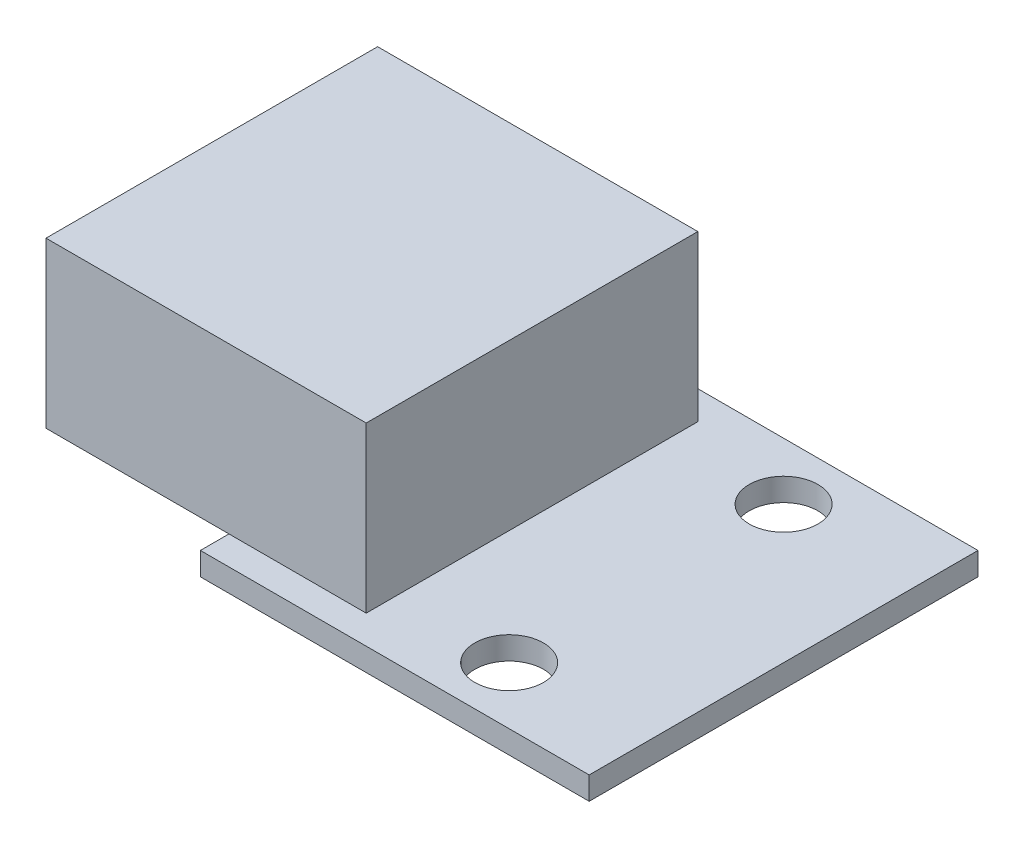
ISO-10303-21;
HEADER;
FILE_DESCRIPTION(('STEP AP214'),'2;1');
FILE_NAME('part.step','',(''),(''),'','','');
FILE_SCHEMA(('AUTOMOTIVE_DESIGN { 1 0 10303 214 1 1 1 1 }'));
ENDSEC;
DATA;
#1=APPLICATION_CONTEXT('core data for automotive mechanical design processes');
#2=APPLICATION_PROTOCOL_DEFINITION('international standard','automotive_design',2000,#1);
#3=PRODUCT_CONTEXT('',#1,'mechanical');
#4=PRODUCT('Part','Part','',(#3));
#5=PRODUCT_RELATED_PRODUCT_CATEGORY('part','',(#4));
#6=PRODUCT_DEFINITION_FORMATION('','',#4);
#7=PRODUCT_DEFINITION_CONTEXT('part definition',#1,'design');
#8=PRODUCT_DEFINITION('design','',#6,#7);
#9=PRODUCT_DEFINITION_SHAPE('','',#8);
#10=(LENGTH_UNIT() NAMED_UNIT(*) SI_UNIT(.MILLI.,.METRE.));
#11=(NAMED_UNIT(*) PLANE_ANGLE_UNIT() SI_UNIT($,.RADIAN.));
#12=(NAMED_UNIT(*) SI_UNIT($,.STERADIAN.) SOLID_ANGLE_UNIT());
#13=UNCERTAINTY_MEASURE_WITH_UNIT(LENGTH_MEASURE(1.E-05),#10,'distance_accuracy_value','');
#14=(GEOMETRIC_REPRESENTATION_CONTEXT(3) GLOBAL_UNCERTAINTY_ASSIGNED_CONTEXT((#13)) GLOBAL_UNIT_ASSIGNED_CONTEXT((#10,
#11,#12)) REPRESENTATION_CONTEXT('',''));
#15=CARTESIAN_POINT('',(0.,0.,0.));
#16=DIRECTION('',(0.,0.,1.));
#17=DIRECTION('',(1.,0.,0.));
#18=AXIS2_PLACEMENT_3D('',#15,#16,#17);
#19=CARTESIAN_POINT('',(0.,1.,0.));
#20=DIRECTION('',(0.,1.,0.));
#21=DIRECTION('',(0.,0.,1.));
#22=AXIS2_PLACEMENT_3D('',#19,#20,#21);
#23=PLANE('',#22);
#24=DIRECTION('',(-1.,0.,0.));
#25=VECTOR('',#24,1.);
#26=CARTESIAN_POINT('',(-11.,1.,-15.75));
#27=LINE('',#26,#25);
#28=CARTESIAN_POINT('',(-11.,1.,-15.75));
#29=VERTEX_POINT('',#28);
#30=CARTESIAN_POINT('',(-17.,1.,-15.75));
#31=VERTEX_POINT('',#30);
#32=EDGE_CURVE('E200',#29,#31,#27,.T.);
#33=ORIENTED_EDGE('',*,*,#32,.F.);
#34=DIRECTION('',(0.,0.,1.));
#35=VECTOR('',#34,1.);
#36=CARTESIAN_POINT('',(-11.,1.,-15.75));
#37=LINE('',#36,#35);
#38=CARTESIAN_POINT('',(-11.,1.,-1.25));
#39=VERTEX_POINT('',#38);
#40=EDGE_CURVE('E171',#29,#39,#37,.T.);
#41=ORIENTED_EDGE('',*,*,#40,.T.);
#42=DIRECTION('',(-1.,0.,0.));
#43=VECTOR('',#42,1.);
#44=CARTESIAN_POINT('',(-11.,1.,-1.25));
#45=LINE('',#44,#43);
#46=CARTESIAN_POINT('',(-17.,1.,-1.25));
#47=VERTEX_POINT('',#46);
#48=EDGE_CURVE('E197',#39,#47,#45,.T.);
#49=ORIENTED_EDGE('',*,*,#48,.T.);
#50=DIRECTION('',(0.,0.,1.));
#51=VECTOR('',#50,1.);
#52=CARTESIAN_POINT('',(-17.,1.,0.));
#53=LINE('',#52,#51);
#54=CARTESIAN_POINT('',(-17.,1.,0.));
#55=VERTEX_POINT('',#54);
#56=EDGE_CURVE('E221',#47,#55,#53,.T.);
#57=ORIENTED_EDGE('',*,*,#56,.T.);
#58=DIRECTION('',(1.,0.,0.));
#59=VECTOR('',#58,1.);
#60=CARTESIAN_POINT('',(0.,1.,0.));
#61=LINE('',#60,#59);
#62=CARTESIAN_POINT('',(0.,1.,0.));
#63=VERTEX_POINT('',#62);
#64=EDGE_CURVE('E225',#55,#63,#61,.T.);
#65=ORIENTED_EDGE('',*,*,#64,.T.);
#66=DIRECTION('',(0.,0.,-1.));
#67=VECTOR('',#66,1.);
#68=CARTESIAN_POINT('',(0.,1.,0.));
#69=LINE('',#68,#67);
#70=CARTESIAN_POINT('',(0.,1.,-17.));
#71=VERTEX_POINT('',#70);
#72=EDGE_CURVE('E215',#63,#71,#69,.T.);
#73=ORIENTED_EDGE('',*,*,#72,.T.);
#74=DIRECTION('',(-1.,0.,0.));
#75=VECTOR('',#74,1.);
#76=CARTESIAN_POINT('',(0.,1.,-17.));
#77=LINE('',#76,#75);
#78=CARTESIAN_POINT('',(-17.,1.,-17.));
#79=VERTEX_POINT('',#78);
#80=EDGE_CURVE('E218',#71,#79,#77,.T.);
#81=ORIENTED_EDGE('',*,*,#80,.T.);
#82=EDGE_CURVE('E222',#79,#31,#53,.T.);
#83=ORIENTED_EDGE('',*,*,#82,.T.);
#84=EDGE_LOOP('',(#33,#41,#49,#57,#65,#73,#81,#83));
#85=FACE_BOUND('',#84,.T.);
#86=CARTESIAN_POINT('',(-6.,1.,-14.5));
#87=DIRECTION('',(0.,1.,0.));
#88=DIRECTION('',(0.,0.,1.));
#89=AXIS2_PLACEMENT_3D('',#86,#87,#88);
#90=CIRCLE('',#89,1.5);
#91=CARTESIAN_POINT('',(-6.,1.,-13.));
#92=VERTEX_POINT('',#91);
#93=EDGE_CURVE('E209',#92,#92,#90,.T.);
#94=ORIENTED_EDGE('',*,*,#93,.F.);
#95=EDGE_LOOP('',(#94));
#96=FACE_BOUND('',#95,.T.);
#97=CARTESIAN_POINT('',(-6.,1.,-2.5));
#98=DIRECTION('',(0.,1.,0.));
#99=DIRECTION('',(0.,0.,1.));
#100=AXIS2_PLACEMENT_3D('',#97,#98,#99);
#101=CIRCLE('',#100,1.5);
#102=CARTESIAN_POINT('',(-6.,1.,-1.));
#103=VERTEX_POINT('',#102);
#104=EDGE_CURVE('E203',#103,#103,#101,.T.);
#105=ORIENTED_EDGE('',*,*,#104,.F.);
#106=EDGE_LOOP('',(#105));
#107=FACE_BOUND('',#106,.T.);
#108=ADVANCED_FACE('F34',(#85,#96,#107),#23,.T.);
#109=CARTESIAN_POINT('',(0.,0.,0.));
#110=DIRECTION('',(0.,1.,0.));
#111=DIRECTION('',(0.,0.,1.));
#112=AXIS2_PLACEMENT_3D('',#109,#110,#111);
#113=PLANE('',#112);
#114=DIRECTION('',(0.,0.,-1.));
#115=VECTOR('',#114,1.);
#116=CARTESIAN_POINT('',(0.,0.,0.));
#117=LINE('',#116,#115);
#118=CARTESIAN_POINT('',(0.,0.,0.));
#119=VERTEX_POINT('',#118);
#120=CARTESIAN_POINT('',(0.,0.,-17.));
#121=VERTEX_POINT('',#120);
#122=EDGE_CURVE('E212',#119,#121,#117,.T.);
#123=ORIENTED_EDGE('',*,*,#122,.F.);
#124=DIRECTION('',(1.,0.,0.));
#125=VECTOR('',#124,1.);
#126=CARTESIAN_POINT('',(0.,0.,0.));
#127=LINE('',#126,#125);
#128=CARTESIAN_POINT('',(-17.,0.,0.));
#129=VERTEX_POINT('',#128);
#130=EDGE_CURVE('E219',#129,#119,#127,.T.);
#131=ORIENTED_EDGE('',*,*,#130,.F.);
#132=DIRECTION('',(0.,0.,1.));
#133=VECTOR('',#132,1.);
#134=CARTESIAN_POINT('',(-17.,0.,0.));
#135=LINE('',#134,#133);
#136=CARTESIAN_POINT('',(-17.,0.,-17.));
#137=VERTEX_POINT('',#136);
#138=EDGE_CURVE('E233',#137,#129,#135,.T.);
#139=ORIENTED_EDGE('',*,*,#138,.F.);
#140=DIRECTION('',(-1.,0.,0.));
#141=VECTOR('',#140,1.);
#142=CARTESIAN_POINT('',(0.,0.,-17.));
#143=LINE('',#142,#141);
#144=EDGE_CURVE('E231',#121,#137,#143,.T.);
#145=ORIENTED_EDGE('',*,*,#144,.F.);
#146=EDGE_LOOP('',(#123,#131,#139,#145));
#147=FACE_BOUND('',#146,.T.);
#148=CARTESIAN_POINT('',(-6.,0.,-14.5));
#149=DIRECTION('',(0.,1.,0.));
#150=DIRECTION('',(0.,0.,1.));
#151=AXIS2_PLACEMENT_3D('',#148,#149,#150);
#152=CIRCLE('',#151,1.5);
#153=CARTESIAN_POINT('',(-6.,0.,-13.));
#154=VERTEX_POINT('',#153);
#155=EDGE_CURVE('E206',#154,#154,#152,.T.);
#156=ORIENTED_EDGE('',*,*,#155,.T.);
#157=EDGE_LOOP('',(#156));
#158=FACE_BOUND('',#157,.T.);
#159=CARTESIAN_POINT('',(-6.,0.,-2.5));
#160=DIRECTION('',(0.,1.,0.));
#161=DIRECTION('',(0.,0.,1.));
#162=AXIS2_PLACEMENT_3D('',#159,#160,#161);
#163=CIRCLE('',#162,1.5);
#164=CARTESIAN_POINT('',(-6.,0.,-1.));
#165=VERTEX_POINT('',#164);
#166=EDGE_CURVE('E194',#165,#165,#163,.T.);
#167=ORIENTED_EDGE('',*,*,#166,.T.);
#168=EDGE_LOOP('',(#167));
#169=FACE_BOUND('',#168,.T.);
#170=ADVANCED_FACE('F252',(#147,#158,#169),#113,.F.);
#171=CARTESIAN_POINT('',(0.,1.,0.));
#172=DIRECTION('',(-1.,0.,0.));
#173=DIRECTION('',(0.,0.,1.));
#174=AXIS2_PLACEMENT_3D('',#171,#172,#173);
#175=PLANE('',#174);
#176=ORIENTED_EDGE('',*,*,#122,.T.);
#177=DIRECTION('',(0.,-1.,0.));
#178=VECTOR('',#177,1.);
#179=CARTESIAN_POINT('',(0.,1.,-17.));
#180=LINE('',#179,#178);
#181=EDGE_CURVE('E11',#71,#121,#180,.T.);
#182=ORIENTED_EDGE('',*,*,#181,.F.);
#183=ORIENTED_EDGE('',*,*,#72,.F.);
#184=DIRECTION('',(0.,-1.,0.));
#185=VECTOR('',#184,1.);
#186=CARTESIAN_POINT('',(0.,1.,0.));
#187=LINE('',#186,#185);
#188=EDGE_CURVE('E228',#63,#119,#187,.T.);
#189=ORIENTED_EDGE('',*,*,#188,.T.);
#190=EDGE_LOOP('',(#176,#182,#183,#189));
#191=FACE_BOUND('',#190,.T.);
#192=ADVANCED_FACE('F36',(#191),#175,.F.);
#193=CARTESIAN_POINT('',(0.,1.,-17.));
#194=DIRECTION('',(0.,0.,1.));
#195=DIRECTION('',(1.,0.,0.));
#196=AXIS2_PLACEMENT_3D('',#193,#194,#195);
#197=PLANE('',#196);
#198=ORIENTED_EDGE('',*,*,#144,.T.);
#199=DIRECTION('',(0.,-1.,0.));
#200=VECTOR('',#199,1.);
#201=CARTESIAN_POINT('',(-17.,1.,-17.));
#202=LINE('',#201,#200);
#203=EDGE_CURVE('E42',#79,#137,#202,.T.);
#204=ORIENTED_EDGE('',*,*,#203,.F.);
#205=ORIENTED_EDGE('',*,*,#80,.F.);
#206=ORIENTED_EDGE('',*,*,#181,.T.);
#207=EDGE_LOOP('',(#198,#204,#205,#206));
#208=FACE_BOUND('',#207,.T.);
#209=ADVANCED_FACE('F301',(#208),#197,.F.);
#210=CARTESIAN_POINT('',(-17.,1.,0.));
#211=DIRECTION('',(1.,0.,0.));
#212=DIRECTION('',(0.,0.,-1.));
#213=AXIS2_PLACEMENT_3D('',#210,#211,#212);
#214=PLANE('',#213);
#215=ORIENTED_EDGE('',*,*,#138,.T.);
#216=DIRECTION('',(0.,-1.,0.));
#217=VECTOR('',#216,1.);
#218=CARTESIAN_POINT('',(-17.,1.,0.));
#219=LINE('',#218,#217);
#220=EDGE_CURVE('E238',#55,#129,#219,.T.);
#221=ORIENTED_EDGE('',*,*,#220,.F.);
#222=ORIENTED_EDGE('',*,*,#56,.F.);
#223=EDGE_CURVE('E226',#31,#47,#53,.T.);
#224=ORIENTED_EDGE('',*,*,#223,.F.);
#225=ORIENTED_EDGE('',*,*,#82,.F.);
#226=ORIENTED_EDGE('',*,*,#203,.T.);
#227=EDGE_LOOP('',(#215,#221,#222,#224,#225,#226));
#228=FACE_BOUND('',#227,.T.);
#229=ADVANCED_FACE('F245',(#228),#214,.F.);
#230=CARTESIAN_POINT('',(0.,1.,0.));
#231=DIRECTION('',(0.,0.,-1.));
#232=DIRECTION('',(-1.,0.,0.));
#233=AXIS2_PLACEMENT_3D('',#230,#231,#232);
#234=PLANE('',#233);
#235=ORIENTED_EDGE('',*,*,#130,.T.);
#236=ORIENTED_EDGE('',*,*,#188,.F.);
#237=ORIENTED_EDGE('',*,*,#64,.F.);
#238=ORIENTED_EDGE('',*,*,#220,.T.);
#239=EDGE_LOOP('',(#235,#236,#237,#238));
#240=FACE_BOUND('',#239,.T.);
#241=ADVANCED_FACE('F256',(#240),#234,.F.);
#242=CARTESIAN_POINT('',(-6.,1.,-14.5));
#243=DIRECTION('',(0.,-1.,0.));
#244=DIRECTION('',(0.,0.,-1.));
#245=AXIS2_PLACEMENT_3D('',#242,#243,#244);
#246=CYLINDRICAL_SURFACE('',#245,1.5);
#247=ORIENTED_EDGE('',*,*,#93,.T.);
#248=EDGE_LOOP('',(#247));
#249=FACE_BOUND('',#248,.T.);
#250=ORIENTED_EDGE('',*,*,#155,.F.);
#251=EDGE_LOOP('',(#250));
#252=FACE_BOUND('',#251,.T.);
#253=ADVANCED_FACE('F295',(#249,#252),#246,.F.);
#254=CARTESIAN_POINT('',(-6.,1.,-2.5));
#255=DIRECTION('',(0.,-1.,0.));
#256=DIRECTION('',(0.,0.,-1.));
#257=AXIS2_PLACEMENT_3D('',#254,#255,#256);
#258=CYLINDRICAL_SURFACE('',#257,1.5);
#259=ORIENTED_EDGE('',*,*,#104,.T.);
#260=EDGE_LOOP('',(#259));
#261=FACE_BOUND('',#260,.T.);
#262=ORIENTED_EDGE('',*,*,#166,.F.);
#263=EDGE_LOOP('',(#262));
#264=FACE_BOUND('',#263,.T.);
#265=ADVANCED_FACE('F342',(#261,#264),#258,.F.);
#266=CARTESIAN_POINT('',(-11.,1.,-15.75));
#267=DIRECTION('',(0.,0.,-1.));
#268=DIRECTION('',(-1.,0.,0.));
#269=AXIS2_PLACEMENT_3D('',#266,#267,#268);
#270=PLANE('',#269);
#271=DIRECTION('',(0.,-1.,0.));
#272=VECTOR('',#271,1.);
#273=CARTESIAN_POINT('',(-25.,1.,-15.75));
#274=LINE('',#273,#272);
#275=CARTESIAN_POINT('',(-25.,8.2,-15.75));
#276=VERTEX_POINT('',#275);
#277=CARTESIAN_POINT('',(-25.,1.,-15.75));
#278=VERTEX_POINT('',#277);
#279=EDGE_CURVE('E164',#276,#278,#274,.T.);
#280=ORIENTED_EDGE('',*,*,#279,.F.);
#281=DIRECTION('',(-1.,0.,0.));
#282=VECTOR('',#281,1.);
#283=CARTESIAN_POINT('',(-11.,8.2,-15.75));
#284=LINE('',#283,#282);
#285=CARTESIAN_POINT('',(-11.,8.2,-15.75));
#286=VERTEX_POINT('',#285);
#287=EDGE_CURVE('E192',#286,#276,#284,.T.);
#288=ORIENTED_EDGE('',*,*,#287,.F.);
#289=DIRECTION('',(0.,-1.,0.));
#290=VECTOR('',#289,1.);
#291=CARTESIAN_POINT('',(-11.,1.,-15.75));
#292=LINE('',#291,#290);
#293=EDGE_CURVE('E168',#286,#29,#292,.T.);
#294=ORIENTED_EDGE('',*,*,#293,.T.);
#295=ORIENTED_EDGE('',*,*,#32,.T.);
#296=EDGE_CURVE('E181',#31,#278,#27,.T.);
#297=ORIENTED_EDGE('',*,*,#296,.T.);
#298=EDGE_LOOP('',(#280,#288,#294,#295,#297));
#299=FACE_BOUND('',#298,.T.);
#300=ADVANCED_FACE('F270',(#299),#270,.T.);
#301=CARTESIAN_POINT('',(-11.,8.2,-15.75));
#302=DIRECTION('',(0.,1.,0.));
#303=DIRECTION('',(0.,0.,1.));
#304=AXIS2_PLACEMENT_3D('',#301,#302,#303);
#305=PLANE('',#304);
#306=DIRECTION('',(0.,0.,-1.));
#307=VECTOR('',#306,1.);
#308=CARTESIAN_POINT('',(-25.,8.2,-15.75));
#309=LINE('',#308,#307);
#310=CARTESIAN_POINT('',(-25.,8.2,-1.25));
#311=VERTEX_POINT('',#310);
#312=EDGE_CURVE('E172',#311,#276,#309,.T.);
#313=ORIENTED_EDGE('',*,*,#312,.F.);
#314=DIRECTION('',(-1.,0.,0.));
#315=VECTOR('',#314,1.);
#316=CARTESIAN_POINT('',(-11.,8.2,-1.25));
#317=LINE('',#316,#315);
#318=CARTESIAN_POINT('',(-11.,8.2,-1.25));
#319=VERTEX_POINT('',#318);
#320=EDGE_CURVE('E195',#319,#311,#317,.T.);
#321=ORIENTED_EDGE('',*,*,#320,.F.);
#322=DIRECTION('',(0.,0.,-1.));
#323=VECTOR('',#322,1.);
#324=CARTESIAN_POINT('',(-11.,8.2,-15.75));
#325=LINE('',#324,#323);
#326=EDGE_CURVE('E178',#319,#286,#325,.T.);
#327=ORIENTED_EDGE('',*,*,#326,.T.);
#328=ORIENTED_EDGE('',*,*,#287,.T.);
#329=EDGE_LOOP('',(#313,#321,#327,#328));
#330=FACE_BOUND('',#329,.T.);
#331=ADVANCED_FACE('F278',(#330),#305,.T.);
#332=CARTESIAN_POINT('',(-11.,1.,-1.25));
#333=DIRECTION('',(0.,0.,1.));
#334=DIRECTION('',(1.,0.,0.));
#335=AXIS2_PLACEMENT_3D('',#332,#333,#334);
#336=PLANE('',#335);
#337=DIRECTION('',(0.,1.,0.));
#338=VECTOR('',#337,1.);
#339=CARTESIAN_POINT('',(-25.,1.,-1.25));
#340=LINE('',#339,#338);
#341=CARTESIAN_POINT('',(-25.,1.,-1.25));
#342=VERTEX_POINT('',#341);
#343=EDGE_CURVE('E187',#342,#311,#340,.T.);
#344=ORIENTED_EDGE('',*,*,#343,.F.);
#345=EDGE_CURVE('E57',#47,#342,#45,.T.);
#346=ORIENTED_EDGE('',*,*,#345,.F.);
#347=ORIENTED_EDGE('',*,*,#48,.F.);
#348=DIRECTION('',(0.,1.,0.));
#349=VECTOR('',#348,1.);
#350=CARTESIAN_POINT('',(-11.,1.,-1.25));
#351=LINE('',#350,#349);
#352=EDGE_CURVE('E175',#39,#319,#351,.T.);
#353=ORIENTED_EDGE('',*,*,#352,.T.);
#354=ORIENTED_EDGE('',*,*,#320,.T.);
#355=EDGE_LOOP('',(#344,#346,#347,#353,#354));
#356=FACE_BOUND('',#355,.T.);
#357=ADVANCED_FACE('F279',(#356),#336,.T.);
#358=CARTESIAN_POINT('',(-11.,1.,-15.75));
#359=DIRECTION('',(0.,-1.,0.));
#360=DIRECTION('',(0.,0.,-1.));
#361=AXIS2_PLACEMENT_3D('',#358,#359,#360);
#362=PLANE('',#361);
#363=ORIENTED_EDGE('',*,*,#296,.F.);
#364=ORIENTED_EDGE('',*,*,#223,.T.);
#365=ORIENTED_EDGE('',*,*,#345,.T.);
#366=DIRECTION('',(0.,0.,1.));
#367=VECTOR('',#366,1.);
#368=CARTESIAN_POINT('',(-25.,1.,-15.75));
#369=LINE('',#368,#367);
#370=EDGE_CURVE('E184',#278,#342,#369,.T.);
#371=ORIENTED_EDGE('',*,*,#370,.F.);
#372=EDGE_LOOP('',(#363,#364,#365,#371));
#373=FACE_BOUND('',#372,.T.);
#374=ADVANCED_FACE('F266',(#373),#362,.T.);
#375=CARTESIAN_POINT('',(-11.,0.,0.));
#376=DIRECTION('',(1.,0.,0.));
#377=DIRECTION('',(0.,0.,-1.));
#378=AXIS2_PLACEMENT_3D('',#375,#376,#377);
#379=PLANE('',#378);
#380=ORIENTED_EDGE('',*,*,#293,.F.);
#381=ORIENTED_EDGE('',*,*,#326,.F.);
#382=ORIENTED_EDGE('',*,*,#352,.F.);
#383=ORIENTED_EDGE('',*,*,#40,.F.);
#384=EDGE_LOOP('',(#380,#381,#382,#383));
#385=FACE_BOUND('',#384,.T.);
#386=ADVANCED_FACE('F274',(#385),#379,.T.);
#387=CARTESIAN_POINT('',(-25.,0.,0.));
#388=DIRECTION('',(1.,0.,0.));
#389=DIRECTION('',(0.,0.,-1.));
#390=AXIS2_PLACEMENT_3D('',#387,#388,#389);
#391=PLANE('',#390);
#392=DIRECTION('',(0.,-1.,0.));
#393=VECTOR('',#392,1.);
#394=CARTESIAN_POINT('',(-25.,7.2,-14.75));
#395=LINE('',#394,#393);
#396=CARTESIAN_POINT('',(-25.,7.2,-14.75));
#397=VERTEX_POINT('',#396);
#398=CARTESIAN_POINT('',(-25.,2.,-14.75));
#399=VERTEX_POINT('',#398);
#400=EDGE_CURVE('E158',#397,#399,#395,.T.);
#401=ORIENTED_EDGE('',*,*,#400,.F.);
#402=DIRECTION('',(0.,0.,-1.));
#403=VECTOR('',#402,1.);
#404=CARTESIAN_POINT('',(-25.,7.2,-2.25));
#405=LINE('',#404,#403);
#406=CARTESIAN_POINT('',(-25.,7.2,-2.25));
#407=VERTEX_POINT('',#406);
#408=EDGE_CURVE('E49',#407,#397,#405,.T.);
#409=ORIENTED_EDGE('',*,*,#408,.F.);
#410=DIRECTION('',(0.,1.,0.));
#411=VECTOR('',#410,1.);
#412=CARTESIAN_POINT('',(-25.,2.,-2.25));
#413=LINE('',#412,#411);
#414=CARTESIAN_POINT('',(-25.,2.,-2.25));
#415=VERTEX_POINT('',#414);
#416=EDGE_CURVE('E149',#415,#407,#413,.T.);
#417=ORIENTED_EDGE('',*,*,#416,.F.);
#418=DIRECTION('',(0.,0.,1.));
#419=VECTOR('',#418,1.);
#420=CARTESIAN_POINT('',(-25.,2.,-14.75));
#421=LINE('',#420,#419);
#422=EDGE_CURVE('E152',#399,#415,#421,.T.);
#423=ORIENTED_EDGE('',*,*,#422,.F.);
#424=EDGE_LOOP('',(#401,#409,#417,#423));
#425=FACE_BOUND('',#424,.T.);
#426=ORIENTED_EDGE('',*,*,#279,.T.);
#427=ORIENTED_EDGE('',*,*,#370,.T.);
#428=ORIENTED_EDGE('',*,*,#343,.T.);
#429=ORIENTED_EDGE('',*,*,#312,.T.);
#430=EDGE_LOOP('',(#426,#427,#428,#429));
#431=FACE_BOUND('',#430,.T.);
#432=ADVANCED_FACE('F377',(#425,#431),#391,.F.);
#433=CARTESIAN_POINT('',(-15.,7.2,-2.25));
#434=DIRECTION('',(0.,1.,0.));
#435=DIRECTION('',(0.,0.,1.));
#436=AXIS2_PLACEMENT_3D('',#433,#434,#435);
#437=PLANE('',#436);
#438=ORIENTED_EDGE('',*,*,#408,.T.);
#439=DIRECTION('',(-1.,0.,0.));
#440=VECTOR('',#439,1.);
#441=CARTESIAN_POINT('',(-15.,7.2,-14.75));
#442=LINE('',#441,#440);
#443=CARTESIAN_POINT('',(-15.,7.2,-14.75));
#444=VERTEX_POINT('',#443);
#445=EDGE_CURVE('E127',#444,#397,#442,.T.);
#446=ORIENTED_EDGE('',*,*,#445,.F.);
#447=DIRECTION('',(0.,0.,-1.));
#448=VECTOR('',#447,1.);
#449=CARTESIAN_POINT('',(-15.,7.2,-2.25));
#450=LINE('',#449,#448);
#451=CARTESIAN_POINT('',(-15.,7.2,-2.25));
#452=VERTEX_POINT('',#451);
#453=EDGE_CURVE('E131',#452,#444,#450,.T.);
#454=ORIENTED_EDGE('',*,*,#453,.F.);
#455=DIRECTION('',(-1.,0.,0.));
#456=VECTOR('',#455,1.);
#457=CARTESIAN_POINT('',(-15.,7.2,-2.25));
#458=LINE('',#457,#456);
#459=EDGE_CURVE('E162',#452,#407,#458,.T.);
#460=ORIENTED_EDGE('',*,*,#459,.T.);
#461=EDGE_LOOP('',(#438,#446,#454,#460));
#462=FACE_BOUND('',#461,.T.);
#463=ADVANCED_FACE('F129',(#462),#437,.F.);
#464=CARTESIAN_POINT('',(-15.,2.,-2.25));
#465=DIRECTION('',(0.,0.,1.));
#466=DIRECTION('',(1.,0.,0.));
#467=AXIS2_PLACEMENT_3D('',#464,#465,#466);
#468=PLANE('',#467);
#469=ORIENTED_EDGE('',*,*,#416,.T.);
#470=ORIENTED_EDGE('',*,*,#459,.F.);
#471=DIRECTION('',(0.,1.,0.));
#472=VECTOR('',#471,1.);
#473=CARTESIAN_POINT('',(-15.,2.,-2.25));
#474=LINE('',#473,#472);
#475=CARTESIAN_POINT('',(-15.,2.,-2.25));
#476=VERTEX_POINT('',#475);
#477=EDGE_CURVE('E137',#476,#452,#474,.T.);
#478=ORIENTED_EDGE('',*,*,#477,.F.);
#479=DIRECTION('',(-1.,0.,0.));
#480=VECTOR('',#479,1.);
#481=CARTESIAN_POINT('',(-15.,2.,-2.25));
#482=LINE('',#481,#480);
#483=EDGE_CURVE('E165',#476,#415,#482,.T.);
#484=ORIENTED_EDGE('',*,*,#483,.T.);
#485=EDGE_LOOP('',(#469,#470,#478,#484));
#486=FACE_BOUND('',#485,.T.);
#487=ADVANCED_FACE('F393',(#486),#468,.F.);
#488=CARTESIAN_POINT('',(-15.,2.,-14.75));
#489=DIRECTION('',(0.,-1.,0.));
#490=DIRECTION('',(0.,0.,-1.));
#491=AXIS2_PLACEMENT_3D('',#488,#489,#490);
#492=PLANE('',#491);
#493=ORIENTED_EDGE('',*,*,#422,.T.);
#494=ORIENTED_EDGE('',*,*,#483,.F.);
#495=DIRECTION('',(0.,0.,1.));
#496=VECTOR('',#495,1.);
#497=CARTESIAN_POINT('',(-15.,2.,-14.75));
#498=LINE('',#497,#496);
#499=CARTESIAN_POINT('',(-15.,2.,-14.75));
#500=VERTEX_POINT('',#499);
#501=EDGE_CURVE('E145',#500,#476,#498,.T.);
#502=ORIENTED_EDGE('',*,*,#501,.F.);
#503=DIRECTION('',(-1.,0.,0.));
#504=VECTOR('',#503,1.);
#505=CARTESIAN_POINT('',(-15.,2.,-14.75));
#506=LINE('',#505,#504);
#507=EDGE_CURVE('E136',#500,#399,#506,.T.);
#508=ORIENTED_EDGE('',*,*,#507,.T.);
#509=EDGE_LOOP('',(#493,#494,#502,#508));
#510=FACE_BOUND('',#509,.T.);
#511=ADVANCED_FACE('F401',(#510),#492,.F.);
#512=CARTESIAN_POINT('',(-15.,7.2,-14.75));
#513=DIRECTION('',(0.,0.,-1.));
#514=DIRECTION('',(-1.,0.,0.));
#515=AXIS2_PLACEMENT_3D('',#512,#513,#514);
#516=PLANE('',#515);
#517=ORIENTED_EDGE('',*,*,#400,.T.);
#518=ORIENTED_EDGE('',*,*,#507,.F.);
#519=DIRECTION('',(0.,-1.,0.));
#520=VECTOR('',#519,1.);
#521=CARTESIAN_POINT('',(-15.,7.2,-14.75));
#522=LINE('',#521,#520);
#523=EDGE_CURVE('E140',#444,#500,#522,.T.);
#524=ORIENTED_EDGE('',*,*,#523,.F.);
#525=ORIENTED_EDGE('',*,*,#445,.T.);
#526=EDGE_LOOP('',(#517,#518,#524,#525));
#527=FACE_BOUND('',#526,.T.);
#528=ADVANCED_FACE('F141',(#527),#516,.F.);
#529=CARTESIAN_POINT('',(-15.,0.,0.));
#530=DIRECTION('',(-1.,0.,0.));
#531=DIRECTION('',(0.,0.,1.));
#532=AXIS2_PLACEMENT_3D('',#529,#530,#531);
#533=PLANE('',#532);
#534=ORIENTED_EDGE('',*,*,#453,.T.);
#535=ORIENTED_EDGE('',*,*,#523,.T.);
#536=ORIENTED_EDGE('',*,*,#501,.T.);
#537=ORIENTED_EDGE('',*,*,#477,.T.);
#538=EDGE_LOOP('',(#534,#535,#536,#537));
#539=FACE_BOUND('',#538,.T.);
#540=ADVANCED_FACE('F147',(#539),#533,.T.);
#541=CLOSED_SHELL('',(#108,#170,#192,#209,#229,#241,#253,#265,#300,#331,#357,#374,#386,#432,
#463,#487,#511,#528,#540));
#542=MANIFOLD_SOLID_BREP('B2',#541);
#543=ADVANCED_BREP_SHAPE_REPRESENTATION('',(#18,#542),#14);
#544=SHAPE_DEFINITION_REPRESENTATION(#9,#543);
ENDSEC;
END-ISO-10303-21;
